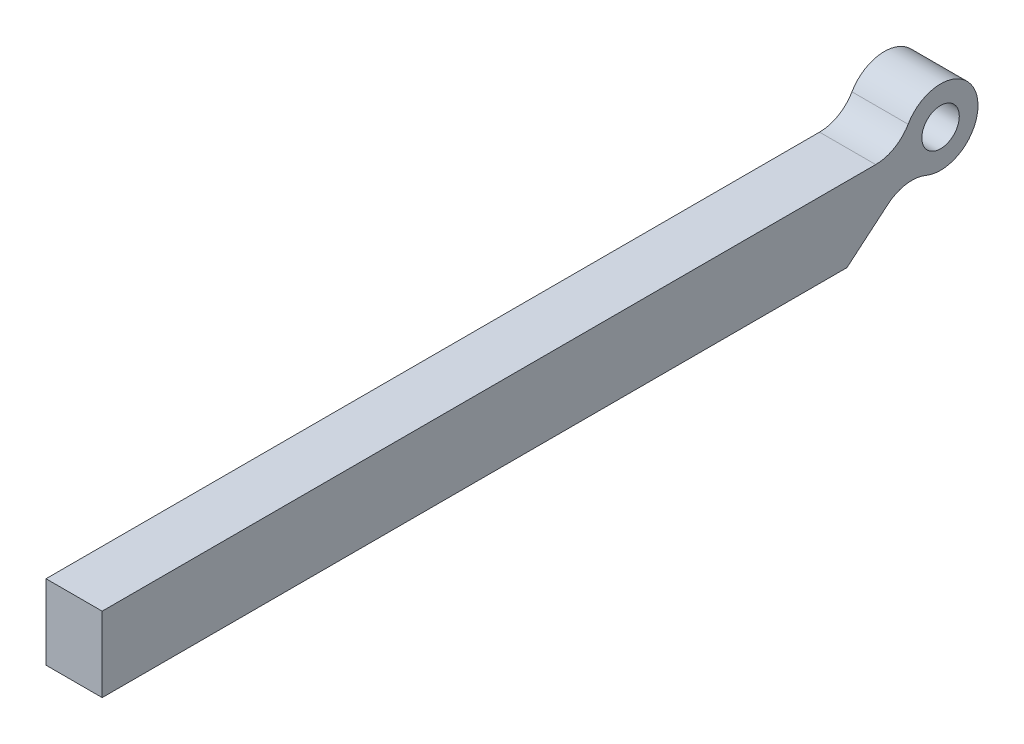
ISO-10303-21;
HEADER;
FILE_DESCRIPTION(('STEP AP214'),'2;1');
FILE_NAME('part.step','',(''),(''),'','','');
FILE_SCHEMA(('AUTOMOTIVE_DESIGN { 1 0 10303 214 1 1 1 1 }'));
ENDSEC;
DATA;
#1=APPLICATION_CONTEXT('core data for automotive mechanical design processes');
#2=APPLICATION_PROTOCOL_DEFINITION('international standard','automotive_design',2000,#1);
#3=PRODUCT_CONTEXT('',#1,'mechanical');
#4=PRODUCT('Part','Part','',(#3));
#5=PRODUCT_RELATED_PRODUCT_CATEGORY('part','',(#4));
#6=PRODUCT_DEFINITION_FORMATION('','',#4);
#7=PRODUCT_DEFINITION_CONTEXT('part definition',#1,'design');
#8=PRODUCT_DEFINITION('design','',#6,#7);
#9=PRODUCT_DEFINITION_SHAPE('','',#8);
#10=(LENGTH_UNIT() NAMED_UNIT(*) SI_UNIT(.MILLI.,.METRE.));
#11=(NAMED_UNIT(*) PLANE_ANGLE_UNIT() SI_UNIT($,.RADIAN.));
#12=(NAMED_UNIT(*) SI_UNIT($,.STERADIAN.) SOLID_ANGLE_UNIT());
#13=UNCERTAINTY_MEASURE_WITH_UNIT(LENGTH_MEASURE(1.E-05),#10,'distance_accuracy_value','');
#14=(GEOMETRIC_REPRESENTATION_CONTEXT(3) GLOBAL_UNCERTAINTY_ASSIGNED_CONTEXT((#13)) GLOBAL_UNIT_ASSIGNED_CONTEXT((#10,
#11,#12)) REPRESENTATION_CONTEXT('',''));
#15=CARTESIAN_POINT('',(0.,0.,0.));
#16=DIRECTION('',(0.,0.,1.));
#17=DIRECTION('',(1.,0.,0.));
#18=AXIS2_PLACEMENT_3D('',#15,#16,#17);
#19=CARTESIAN_POINT('',(-1.5,2.82842712474617,47.6028629718361));
#20=DIRECTION('',(0.,0.,1.));
#21=DIRECTION('',(1.,0.,0.));
#22=AXIS2_PLACEMENT_3D('',#19,#20,#21);
#23=PLANE('',#22);
#24=DIRECTION('',(1.,0.,0.));
#25=VECTOR('',#24,1.);
#26=CARTESIAN_POINT('',(-1.5,-1.17157287525383,47.6028629718361));
#27=LINE('',#26,#25);
#28=CARTESIAN_POINT('',(-1.5,-1.17157287525383,47.6028629718361));
#29=VERTEX_POINT('',#28);
#30=CARTESIAN_POINT('',(1.5,-1.17157287525383,47.6028629718361));
#31=VERTEX_POINT('',#30);
#32=EDGE_CURVE('E40',#29,#31,#27,.T.);
#33=ORIENTED_EDGE('',*,*,#32,.T.);
#34=DIRECTION('',(0.,-1.,0.));
#35=VECTOR('',#34,1.);
#36=CARTESIAN_POINT('',(1.5,2.82842712474617,47.6028629718361));
#37=LINE('',#36,#35);
#38=CARTESIAN_POINT('',(1.5,2.82842712474617,47.6028629718361));
#39=VERTEX_POINT('',#38);
#40=EDGE_CURVE('E95',#39,#31,#37,.T.);
#41=ORIENTED_EDGE('',*,*,#40,.F.);
#42=DIRECTION('',(1.,0.,0.));
#43=VECTOR('',#42,1.);
#44=CARTESIAN_POINT('',(-1.5,2.82842712474617,47.6028629718361));
#45=LINE('',#44,#43);
#46=CARTESIAN_POINT('',(-1.5,2.82842712474617,47.6028629718361));
#47=VERTEX_POINT('',#46);
#48=EDGE_CURVE('E11',#47,#39,#45,.T.);
#49=ORIENTED_EDGE('',*,*,#48,.F.);
#50=DIRECTION('',(0.,-1.,0.));
#51=VECTOR('',#50,1.);
#52=CARTESIAN_POINT('',(-1.5,2.82842712474617,47.6028629718361));
#53=LINE('',#52,#51);
#54=EDGE_CURVE('E96',#47,#29,#53,.T.);
#55=ORIENTED_EDGE('',*,*,#54,.T.);
#56=EDGE_LOOP('',(#33,#41,#49,#55));
#57=FACE_BOUND('',#56,.T.);
#58=ADVANCED_FACE('F37',(#57),#23,.T.);
#59=CARTESIAN_POINT('',(-1.5,2.82842712474617,6.29252873988396));
#60=DIRECTION('',(0.,1.,0.));
#61=DIRECTION('',(0.,0.,1.));
#62=AXIS2_PLACEMENT_3D('',#59,#60,#61);
#63=PLANE('',#62);
#64=ORIENTED_EDGE('',*,*,#48,.T.);
#65=DIRECTION('',(0.,0.,1.));
#66=VECTOR('',#65,1.);
#67=CARTESIAN_POINT('',(1.5,2.82842712474617,6.29252873988396));
#68=LINE('',#67,#66);
#69=CARTESIAN_POINT('',(1.5,2.82842712474617,6.29252873988396));
#70=VERTEX_POINT('',#69);
#71=EDGE_CURVE('E114',#70,#39,#68,.T.);
#72=ORIENTED_EDGE('',*,*,#71,.F.);
#73=DIRECTION('',(1.,0.,0.));
#74=VECTOR('',#73,1.);
#75=CARTESIAN_POINT('',(-1.5,2.82842712474617,6.29252873988396));
#76=LINE('',#75,#74);
#77=CARTESIAN_POINT('',(-1.5,2.82842712474617,6.29252873988396));
#78=VERTEX_POINT('',#77);
#79=EDGE_CURVE('E45',#78,#70,#76,.T.);
#80=ORIENTED_EDGE('',*,*,#79,.F.);
#81=DIRECTION('',(0.,0.,1.));
#82=VECTOR('',#81,1.);
#83=CARTESIAN_POINT('',(-1.5,2.82842712474617,6.29252873988396));
#84=LINE('',#83,#82);
#85=EDGE_CURVE('E101',#78,#47,#84,.T.);
#86=ORIENTED_EDGE('',*,*,#85,.T.);
#87=EDGE_LOOP('',(#64,#72,#80,#86));
#88=FACE_BOUND('',#87,.T.);
#89=ADVANCED_FACE('F172',(#88),#63,.T.);
#90=CARTESIAN_POINT('',(-1.5,4.82842712474617,6.29252873988396));
#91=DIRECTION('',(1.,0.,0.));
#92=DIRECTION('',(0.,0.,-1.));
#93=AXIS2_PLACEMENT_3D('',#90,#91,#92);
#94=CYLINDRICAL_SURFACE('',#93,2.);
#95=ORIENTED_EDGE('',*,*,#79,.T.);
#96=CARTESIAN_POINT('',(1.5,4.82842712474617,6.29252873988396));
#97=DIRECTION('',(-1.,0.,0.));
#98=DIRECTION('',(0.,0.,-1.));
#99=AXIS2_PLACEMENT_3D('',#96,#97,#98);
#100=CIRCLE('',#99,2.);
#101=CARTESIAN_POINT('',(1.5,3.82842712474617,4.56047793231508));
#102=VERTEX_POINT('',#101);
#103=EDGE_CURVE('E127',#102,#70,#100,.T.);
#104=ORIENTED_EDGE('',*,*,#103,.F.);
#105=DIRECTION('',(1.,0.,0.));
#106=VECTOR('',#105,1.);
#107=CARTESIAN_POINT('',(-1.5,3.82842712474617,4.56047793231508));
#108=LINE('',#107,#106);
#109=CARTESIAN_POINT('',(-1.5,3.82842712474617,4.56047793231508));
#110=VERTEX_POINT('',#109);
#111=EDGE_CURVE('E149',#110,#102,#108,.T.);
#112=ORIENTED_EDGE('',*,*,#111,.F.);
#113=CARTESIAN_POINT('',(-1.5,4.82842712474617,6.29252873988396));
#114=DIRECTION('',(-1.,0.,0.));
#115=DIRECTION('',(0.,0.,-1.));
#116=AXIS2_PLACEMENT_3D('',#113,#114,#115);
#117=CIRCLE('',#116,2.);
#118=EDGE_CURVE('E145',#110,#78,#117,.T.);
#119=ORIENTED_EDGE('',*,*,#118,.T.);
#120=EDGE_LOOP('',(#95,#104,#112,#119));
#121=FACE_BOUND('',#120,.T.);
#122=ADVANCED_FACE('F170',(#121),#94,.F.);
#123=CARTESIAN_POINT('',(-1.5,2.82842712474617,2.82842712474621));
#124=DIRECTION('',(1.,0.,0.));
#125=DIRECTION('',(0.,0.,-1.));
#126=AXIS2_PLACEMENT_3D('',#123,#124,#125);
#127=CYLINDRICAL_SURFACE('',#126,2.);
#128=ORIENTED_EDGE('',*,*,#111,.T.);
#129=CARTESIAN_POINT('',(1.5,2.82842712474617,2.82842712474621));
#130=DIRECTION('',(1.,0.,0.));
#131=DIRECTION('',(0.,0.,-1.));
#132=AXIS2_PLACEMENT_3D('',#129,#130,#131);
#133=CIRCLE('',#132,2.);
#134=CARTESIAN_POINT('',(1.5,0.979968611984142,3.59210318604286));
#135=VERTEX_POINT('',#134);
#136=EDGE_CURVE('E124',#135,#102,#133,.T.);
#137=ORIENTED_EDGE('',*,*,#136,.F.);
#138=DIRECTION('',(1.,0.,0.));
#139=VECTOR('',#138,1.);
#140=CARTESIAN_POINT('',(-1.5,0.979968611984142,3.59210318604286));
#141=LINE('',#140,#139);
#142=CARTESIAN_POINT('',(-1.5,0.979968611984142,3.59210318604286));
#143=VERTEX_POINT('',#142);
#144=EDGE_CURVE('E151',#143,#135,#141,.T.);
#145=ORIENTED_EDGE('',*,*,#144,.F.);
#146=CARTESIAN_POINT('',(-1.5,2.82842712474617,2.82842712474621));
#147=DIRECTION('',(1.,0.,0.));
#148=DIRECTION('',(0.,0.,-1.));
#149=AXIS2_PLACEMENT_3D('',#146,#147,#148);
#150=CIRCLE('',#149,2.);
#151=EDGE_CURVE('E142',#143,#110,#150,.T.);
#152=ORIENTED_EDGE('',*,*,#151,.T.);
#153=EDGE_LOOP('',(#128,#137,#145,#152));
#154=FACE_BOUND('',#153,.T.);
#155=ADVANCED_FACE('F164',(#154),#127,.T.);
#156=CARTESIAN_POINT('',(-1.5,-0.868489900777891,4.35577924733952));
#157=DIRECTION('',(1.,0.,0.));
#158=DIRECTION('',(0.,0.,-1.));
#159=AXIS2_PLACEMENT_3D('',#156,#157,#158);
#160=CYLINDRICAL_SURFACE('',#159,2.);
#161=ORIENTED_EDGE('',*,*,#144,.T.);
#162=CARTESIAN_POINT('',(1.5,-0.868489900777891,4.35577924733952));
#163=DIRECTION('',(-1.,0.,0.));
#164=DIRECTION('',(0.,0.,-1.));
#165=AXIS2_PLACEMENT_3D('',#162,#163,#164);
#166=CIRCLE('',#165,2.);
#167=CARTESIAN_POINT('',(1.5,0.663598985460072,5.64135446671259));
#168=VERTEX_POINT('',#167);
#169=EDGE_CURVE('E121',#168,#135,#166,.T.);
#170=ORIENTED_EDGE('',*,*,#169,.F.);
#171=DIRECTION('',(1.,0.,0.));
#172=VECTOR('',#171,1.);
#173=CARTESIAN_POINT('',(-1.5,0.663598985460072,5.64135446671259));
#174=LINE('',#173,#172);
#175=CARTESIAN_POINT('',(-1.5,0.663598985460072,5.64135446671259));
#176=VERTEX_POINT('',#175);
#177=EDGE_CURVE('E153',#176,#168,#174,.T.);
#178=ORIENTED_EDGE('',*,*,#177,.F.);
#179=CARTESIAN_POINT('',(-1.5,-0.868489900777891,4.35577924733952));
#180=DIRECTION('',(-1.,0.,0.));
#181=DIRECTION('',(0.,0.,-1.));
#182=AXIS2_PLACEMENT_3D('',#179,#180,#181);
#183=CIRCLE('',#182,2.);
#184=EDGE_CURVE('E139',#176,#143,#183,.T.);
#185=ORIENTED_EDGE('',*,*,#184,.T.);
#186=EDGE_LOOP('',(#161,#170,#178,#185));
#187=FACE_BOUND('',#186,.T.);
#188=ADVANCED_FACE('F161',(#187),#160,.F.);
#189=CARTESIAN_POINT('',(-1.5,-1.17157287525383,7.8284271247462));
#190=DIRECTION('',(0.,-0.766044443118981,-0.642787609686535));
#191=DIRECTION('',(0.,0.642787609686535,-0.766044443118982));
#192=AXIS2_PLACEMENT_3D('',#189,#190,#191);
#193=PLANE('',#192);
#194=ORIENTED_EDGE('',*,*,#177,.T.);
#195=DIRECTION('',(0.,0.642787609686535,-0.766044443118981));
#196=VECTOR('',#195,1.);
#197=CARTESIAN_POINT('',(1.5,-1.17157287525383,7.8284271247462));
#198=LINE('',#197,#196);
#199=CARTESIAN_POINT('',(1.5,-1.17157287525383,7.8284271247462));
#200=VERTEX_POINT('',#199);
#201=EDGE_CURVE('E108',#200,#168,#198,.T.);
#202=ORIENTED_EDGE('',*,*,#201,.F.);
#203=DIRECTION('',(1.,0.,0.));
#204=VECTOR('',#203,1.);
#205=CARTESIAN_POINT('',(-1.5,-1.17157287525383,7.8284271247462));
#206=LINE('',#205,#204);
#207=CARTESIAN_POINT('',(-1.5,-1.17157287525383,7.8284271247462));
#208=VERTEX_POINT('',#207);
#209=EDGE_CURVE('E100',#208,#200,#206,.T.);
#210=ORIENTED_EDGE('',*,*,#209,.F.);
#211=DIRECTION('',(0.,0.642787609686535,-0.766044443118981));
#212=VECTOR('',#211,1.);
#213=CARTESIAN_POINT('',(-1.5,-1.17157287525383,7.8284271247462));
#214=LINE('',#213,#212);
#215=EDGE_CURVE('E136',#208,#176,#214,.T.);
#216=ORIENTED_EDGE('',*,*,#215,.T.);
#217=EDGE_LOOP('',(#194,#202,#210,#216));
#218=FACE_BOUND('',#217,.T.);
#219=ADVANCED_FACE('F155',(#218),#193,.T.);
#220=CARTESIAN_POINT('',(-1.5,-1.17157287525383,7.8284271247462));
#221=DIRECTION('',(0.,-1.,0.));
#222=DIRECTION('',(0.,0.,-1.));
#223=AXIS2_PLACEMENT_3D('',#220,#221,#222);
#224=PLANE('',#223);
#225=ORIENTED_EDGE('',*,*,#209,.T.);
#226=DIRECTION('',(0.,0.,-1.));
#227=VECTOR('',#226,1.);
#228=CARTESIAN_POINT('',(1.5,-1.17157287525383,7.8284271247462));
#229=LINE('',#228,#227);
#230=EDGE_CURVE('E103',#31,#200,#229,.T.);
#231=ORIENTED_EDGE('',*,*,#230,.F.);
#232=ORIENTED_EDGE('',*,*,#32,.F.);
#233=DIRECTION('',(0.,0.,-1.));
#234=VECTOR('',#233,1.);
#235=CARTESIAN_POINT('',(-1.5,-1.17157287525383,7.8284271247462));
#236=LINE('',#235,#234);
#237=EDGE_CURVE('E134',#29,#208,#236,.T.);
#238=ORIENTED_EDGE('',*,*,#237,.T.);
#239=EDGE_LOOP('',(#225,#231,#232,#238));
#240=FACE_BOUND('',#239,.T.);
#241=ADVANCED_FACE('F104',(#240),#224,.T.);
#242=CARTESIAN_POINT('',(-1.5,-0.868489900777891,4.35577924733952));
#243=DIRECTION('',(1.,0.,0.));
#244=DIRECTION('',(0.,0.,-1.));
#245=AXIS2_PLACEMENT_3D('',#242,#243,#244);
#246=PLANE('',#245);
#247=CARTESIAN_POINT('',(-1.5,2.82842712474617,2.82842712474621));
#248=DIRECTION('',(1.,0.,0.));
#249=DIRECTION('',(0.,0.,-1.));
#250=AXIS2_PLACEMENT_3D('',#247,#248,#249);
#251=CIRCLE('',#250,1.);
#252=CARTESIAN_POINT('',(-1.5,2.82842712474617,1.82842712474621));
#253=VERTEX_POINT('',#252);
#254=EDGE_CURVE('E130',#253,#253,#251,.T.);
#255=ORIENTED_EDGE('',*,*,#254,.T.);
#256=EDGE_LOOP('',(#255));
#257=FACE_BOUND('',#256,.T.);
#258=ORIENTED_EDGE('',*,*,#54,.F.);
#259=ORIENTED_EDGE('',*,*,#85,.F.);
#260=ORIENTED_EDGE('',*,*,#118,.F.);
#261=ORIENTED_EDGE('',*,*,#151,.F.);
#262=ORIENTED_EDGE('',*,*,#184,.F.);
#263=ORIENTED_EDGE('',*,*,#215,.F.);
#264=ORIENTED_EDGE('',*,*,#237,.F.);
#265=EDGE_LOOP('',(#258,#259,#260,#261,#262,#263,#264));
#266=FACE_BOUND('',#265,.T.);
#267=ADVANCED_FACE('F167',(#257,#266),#246,.F.);
#268=CARTESIAN_POINT('',(-1.5,2.82842712474617,2.82842712474621));
#269=DIRECTION('',(1.,0.,0.));
#270=DIRECTION('',(0.,0.,-1.));
#271=AXIS2_PLACEMENT_3D('',#268,#269,#270);
#272=CYLINDRICAL_SURFACE('',#271,1.);
#273=ORIENTED_EDGE('',*,*,#254,.F.);
#274=EDGE_LOOP('',(#273));
#275=FACE_BOUND('',#274,.T.);
#276=CARTESIAN_POINT('',(1.5,2.82842712474617,2.82842712474621));
#277=DIRECTION('',(1.,0.,0.));
#278=DIRECTION('',(0.,0.,-1.));
#279=AXIS2_PLACEMENT_3D('',#276,#277,#278);
#280=CIRCLE('',#279,1.);
#281=CARTESIAN_POINT('',(1.5,2.82842712474617,1.82842712474621));
#282=VERTEX_POINT('',#281);
#283=EDGE_CURVE('E115',#282,#282,#280,.T.);
#284=ORIENTED_EDGE('',*,*,#283,.T.);
#285=EDGE_LOOP('',(#284));
#286=FACE_BOUND('',#285,.T.);
#287=ADVANCED_FACE('F192',(#275,#286),#272,.F.);
#288=CARTESIAN_POINT('',(1.5,-0.868489900777891,4.35577924733952));
#289=DIRECTION('',(1.,0.,0.));
#290=DIRECTION('',(0.,0.,-1.));
#291=AXIS2_PLACEMENT_3D('',#288,#289,#290);
#292=PLANE('',#291);
#293=ORIENTED_EDGE('',*,*,#40,.T.);
#294=ORIENTED_EDGE('',*,*,#230,.T.);
#295=ORIENTED_EDGE('',*,*,#201,.T.);
#296=ORIENTED_EDGE('',*,*,#169,.T.);
#297=ORIENTED_EDGE('',*,*,#136,.T.);
#298=ORIENTED_EDGE('',*,*,#103,.T.);
#299=ORIENTED_EDGE('',*,*,#71,.T.);
#300=EDGE_LOOP('',(#293,#294,#295,#296,#297,#298,#299));
#301=FACE_BOUND('',#300,.T.);
#302=ORIENTED_EDGE('',*,*,#283,.F.);
#303=EDGE_LOOP('',(#302));
#304=FACE_BOUND('',#303,.T.);
#305=ADVANCED_FACE('F111',(#301,#304),#292,.T.);
#306=CLOSED_SHELL('',(#58,#89,#122,#155,#188,#219,#241,#267,#287,#305));
#307=MANIFOLD_SOLID_BREP('B2',#306);
#308=ADVANCED_BREP_SHAPE_REPRESENTATION('',(#18,#307),#14);
#309=SHAPE_DEFINITION_REPRESENTATION(#9,#308);
ENDSEC;
END-ISO-10303-21;
